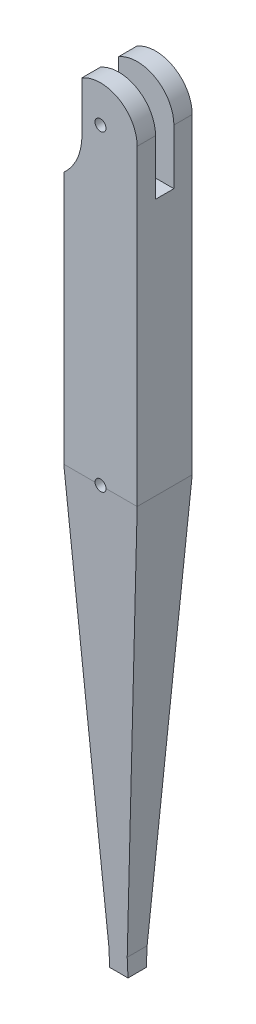
ISO-10303-21;
HEADER;
FILE_DESCRIPTION(('STEP AP214'),'2;1');
FILE_NAME('part.step','',(''),(''),'','','');
FILE_SCHEMA(('AUTOMOTIVE_DESIGN { 1 0 10303 214 1 1 1 1 }'));
ENDSEC;
DATA;
#1=APPLICATION_CONTEXT('core data for automotive mechanical design processes');
#2=APPLICATION_PROTOCOL_DEFINITION('international standard','automotive_design',2000,#1);
#3=PRODUCT_CONTEXT('',#1,'mechanical');
#4=PRODUCT('Part','Part','',(#3));
#5=PRODUCT_RELATED_PRODUCT_CATEGORY('part','',(#4));
#6=PRODUCT_DEFINITION_FORMATION('','',#4);
#7=PRODUCT_DEFINITION_CONTEXT('part definition',#1,'design');
#8=PRODUCT_DEFINITION('design','',#6,#7);
#9=PRODUCT_DEFINITION_SHAPE('','',#8);
#10=(LENGTH_UNIT() NAMED_UNIT(*) SI_UNIT(.MILLI.,.METRE.));
#11=(NAMED_UNIT(*) PLANE_ANGLE_UNIT() SI_UNIT($,.RADIAN.));
#12=(NAMED_UNIT(*) SI_UNIT($,.STERADIAN.) SOLID_ANGLE_UNIT());
#13=UNCERTAINTY_MEASURE_WITH_UNIT(LENGTH_MEASURE(1.E-05),#10,'distance_accuracy_value','');
#14=(GEOMETRIC_REPRESENTATION_CONTEXT(3) GLOBAL_UNCERTAINTY_ASSIGNED_CONTEXT((#13)) GLOBAL_UNIT_ASSIGNED_CONTEXT((#10,
#11,#12)) REPRESENTATION_CONTEXT('',''));
#15=CARTESIAN_POINT('',(0.,0.,0.));
#16=DIRECTION('',(0.,0.,1.));
#17=DIRECTION('',(1.,0.,0.));
#18=AXIS2_PLACEMENT_3D('',#15,#16,#17);
#19=CARTESIAN_POINT('',(0.,-85.,15.));
#20=DIRECTION('',(0.,0.,-1.));
#21=DIRECTION('',(-1.,0.,0.));
#22=AXIS2_PLACEMENT_3D('',#19,#20,#21);
#23=CYLINDRICAL_SURFACE('',#22,1.5);
#24=CARTESIAN_POINT('',(0.,-85.,10.));
#25=DIRECTION('',(0.,0.,1.));
#26=DIRECTION('',(1.,0.,0.));
#27=AXIS2_PLACEMENT_3D('',#24,#25,#26);
#28=CIRCLE('',#27,1.5);
#29=CARTESIAN_POINT('',(1.50000000000001,-85.,10.));
#30=VERTEX_POINT('',#29);
#31=EDGE_CURVE('E252',#30,#30,#28,.T.);
#32=ORIENTED_EDGE('',*,*,#31,.F.);
#33=EDGE_LOOP('',(#32));
#34=FACE_BOUND('',#33,.T.);
#35=CARTESIAN_POINT('',(0.,-85.,15.));
#36=DIRECTION('',(0.,0.,1.));
#37=DIRECTION('',(1.,0.,0.));
#38=AXIS2_PLACEMENT_3D('',#35,#36,#37);
#39=CIRCLE('',#38,1.5);
#40=CARTESIAN_POINT('',(1.50000000000001,-85.,15.));
#41=VERTEX_POINT('',#40);
#42=CARTESIAN_POINT('',(-1.49999999999999,-85.,15.));
#43=VERTEX_POINT('',#42);
#44=EDGE_CURVE('E315',#41,#43,#39,.T.);
#45=ORIENTED_EDGE('',*,*,#44,.T.);
#46=CARTESIAN_POINT('',(0.,-85.,15.));
#47=DIRECTION('',(0.,-0.0425147166248137,0.999095840683121));
#48=DIRECTION('',(0.,-0.999095840683121,-0.0425147166248137));
#49=AXIS2_PLACEMENT_3D('',#46,#47,#48);
#50=ELLIPSE('',#49,1.50135746634116,1.5);
#51=EDGE_CURVE('E356',#43,#41,#50,.T.);
#52=ORIENTED_EDGE('',*,*,#51,.T.);
#53=EDGE_LOOP('',(#45,#52));
#54=FACE_BOUND('',#53,.T.);
#55=ADVANCED_FACE('F33',(#34,#54),#23,.F.);
#56=CARTESIAN_POINT('',(0.,0.,15.));
#57=DIRECTION('',(0.,0.,1.));
#58=DIRECTION('',(1.,0.,0.));
#59=AXIS2_PLACEMENT_3D('',#56,#57,#58);
#60=PLANE('',#59);
#61=CARTESIAN_POINT('',(-20.0470114766486,-5.,15.));
#62=DIRECTION('',(0.,0.,1.));
#63=DIRECTION('',(1.,0.,0.));
#64=AXIS2_PLACEMENT_3D('',#61,#62,#63);
#65=CIRCLE('',#64,15.);
#66=CARTESIAN_POINT('',(-10.,-16.1381129635181,15.));
#67=VERTEX_POINT('',#66);
#68=CARTESIAN_POINT('',(-5.04701147664864,-4.9999999999999,15.));
#69=VERTEX_POINT('',#68);
#70=EDGE_CURVE('E219',#67,#69,#65,.T.);
#71=ORIENTED_EDGE('',*,*,#70,.F.);
#72=DIRECTION('',(0.,-1.,0.));
#73=VECTOR('',#72,1.);
#74=CARTESIAN_POINT('',(-10.,0.,15.));
#75=LINE('',#74,#73);
#76=CARTESIAN_POINT('',(-10.,-85.,15.));
#77=VERTEX_POINT('',#76);
#78=EDGE_CURVE('E324',#67,#77,#75,.T.);
#79=ORIENTED_EDGE('',*,*,#78,.T.);
#80=DIRECTION('',(1.,0.,0.));
#81=VECTOR('',#80,1.);
#82=CARTESIAN_POINT('',(-50.,-85.,15.));
#83=LINE('',#82,#81);
#84=EDGE_CURVE('E279',#77,#43,#83,.T.);
#85=ORIENTED_EDGE('',*,*,#84,.T.);
#86=ORIENTED_EDGE('',*,*,#44,.F.);
#87=CARTESIAN_POINT('',(10.,-85.,15.));
#88=VERTEX_POINT('',#87);
#89=EDGE_CURVE('E275',#41,#88,#83,.T.);
#90=ORIENTED_EDGE('',*,*,#89,.T.);
#91=DIRECTION('',(0.,1.,0.));
#92=VECTOR('',#91,1.);
#93=CARTESIAN_POINT('',(10.,0.,15.));
#94=LINE('',#93,#92);
#95=CARTESIAN_POINT('',(10.,0.,15.));
#96=VERTEX_POINT('',#95);
#97=EDGE_CURVE('E327',#88,#96,#94,.T.);
#98=ORIENTED_EDGE('',*,*,#97,.T.);
#99=CARTESIAN_POINT('',(0.,0.,15.));
#100=DIRECTION('',(0.,0.,1.));
#101=DIRECTION('',(1.,0.,0.));
#102=AXIS2_PLACEMENT_3D('',#99,#100,#101);
#103=CIRCLE('',#102,10.);
#104=CARTESIAN_POINT('',(-5.04701147664864,8.63294128061676,15.));
#105=VERTEX_POINT('',#104);
#106=EDGE_CURVE('E321',#96,#105,#103,.T.);
#107=ORIENTED_EDGE('',*,*,#106,.T.);
#108=DIRECTION('',(0.,1.,0.));
#109=VECTOR('',#108,1.);
#110=CARTESIAN_POINT('',(-5.04701147664864,0.,15.));
#111=LINE('',#110,#109);
#112=EDGE_CURVE('E210',#69,#105,#111,.T.);
#113=ORIENTED_EDGE('',*,*,#112,.F.);
#114=EDGE_LOOP('',(#71,#79,#85,#86,#90,#98,#107,#113));
#115=FACE_BOUND('',#114,.T.);
#116=CARTESIAN_POINT('',(0.,0.,15.));
#117=DIRECTION('',(0.,0.,1.));
#118=DIRECTION('',(1.,0.,0.));
#119=AXIS2_PLACEMENT_3D('',#116,#117,#118);
#120=CIRCLE('',#119,1.5);
#121=CARTESIAN_POINT('',(1.5,0.,15.));
#122=VERTEX_POINT('',#121);
#123=EDGE_CURVE('E309',#122,#122,#120,.T.);
#124=ORIENTED_EDGE('',*,*,#123,.F.);
#125=EDGE_LOOP('',(#124));
#126=FACE_BOUND('',#125,.T.);
#127=ADVANCED_FACE('F430',(#115,#126),#60,.T.);
#128=CARTESIAN_POINT('',(-2.49701529049241,-197.5,15.));
#129=DIRECTION('',(0.997783400521174,0.0665453653112076,0.));
#130=DIRECTION('',(-0.0665453653112076,0.997783400521174,0.));
#131=AXIS2_PLACEMENT_3D('',#128,#129,#130);
#132=PLANE('',#131);
#133=DIRECTION('',(0.,0.,-1.));
#134=VECTOR('',#133,1.);
#135=CARTESIAN_POINT('',(-10.,-85.,15.));
#136=LINE('',#135,#134);
#137=CARTESIAN_POINT('',(-10.,-85.,10.));
#138=VERTEX_POINT('',#137);
#139=EDGE_CURVE('E353',#77,#138,#136,.T.);
#140=ORIENTED_EDGE('',*,*,#139,.T.);
#141=DIRECTION('',(0.0665453653112076,-0.997783400521174,0.));
#142=VECTOR('',#141,1.);
#143=CARTESIAN_POINT('',(-2.49701529049241,-197.5,10.));
#144=LINE('',#143,#142);
#145=CARTESIAN_POINT('',(-8.99960203873232,-100.,10.));
#146=VERTEX_POINT('',#145);
#147=EDGE_CURVE('E255',#138,#146,#144,.T.);
#148=ORIENTED_EDGE('',*,*,#147,.T.);
#149=DIRECTION('',(0.,0.,-1.));
#150=VECTOR('',#149,1.);
#151=CARTESIAN_POINT('',(-8.99960203873232,-100.,15.));
#152=LINE('',#151,#150);
#153=CARTESIAN_POINT('',(-8.99960203873232,-100.,5.));
#154=VERTEX_POINT('',#153);
#155=EDGE_CURVE('E369',#146,#154,#152,.T.);
#156=ORIENTED_EDGE('',*,*,#155,.T.);
#157=DIRECTION('',(-0.0665453653112076,0.997783400521174,0.));
#158=VECTOR('',#157,1.);
#159=CARTESIAN_POINT('',(-2.49701529049241,-197.5,5.));
#160=LINE('',#159,#158);
#161=CARTESIAN_POINT('',(-10.,-85.,5.));
#162=VERTEX_POINT('',#161);
#163=EDGE_CURVE('E249',#154,#162,#160,.T.);
#164=ORIENTED_EDGE('',*,*,#163,.T.);
#165=CARTESIAN_POINT('',(-10.,-85.,0.));
#166=VERTEX_POINT('',#165);
#167=EDGE_CURVE('E352',#162,#166,#136,.T.);
#168=ORIENTED_EDGE('',*,*,#167,.T.);
#169=DIRECTION('',(0.0664854637788897,-0.996885234971507,0.0424206482966599));
#170=VECTOR('',#169,1.);
#171=CARTESIAN_POINT('',(-2.46821164988845,-197.931882736458,4.80561203133864));
#172=LINE('',#171,#170);
#173=CARTESIAN_POINT('',(-2.49701529049241,-197.5,4.78723404255319));
#174=VERTEX_POINT('',#173);
#175=EDGE_CURVE('E272',#166,#174,#172,.T.);
#176=ORIENTED_EDGE('',*,*,#175,.T.);
#177=DIRECTION('',(0.,0.,-1.));
#178=VECTOR('',#177,1.);
#179=CARTESIAN_POINT('',(-2.49701529049241,-197.5,15.));
#180=LINE('',#179,#178);
#181=CARTESIAN_POINT('',(-2.49701529049241,-197.5,10.2127659574468));
#182=VERTEX_POINT('',#181);
#183=EDGE_CURVE('E349',#182,#174,#180,.T.);
#184=ORIENTED_EDGE('',*,*,#183,.F.);
#185=DIRECTION('',(0.0664854637788897,-0.996885234971507,-0.0424206482966599));
#186=VECTOR('',#185,1.);
#187=CARTESIAN_POINT('',(-2.51051699702552,-197.297554967285,10.22138063969));
#188=LINE('',#187,#186);
#189=EDGE_CURVE('E287',#77,#182,#188,.T.);
#190=ORIENTED_EDGE('',*,*,#189,.F.);
#191=EDGE_LOOP('',(#140,#148,#156,#164,#168,#176,#184,#190));
#192=FACE_BOUND('',#191,.T.);
#193=ADVANCED_FACE('F407',(#192),#132,.F.);
#194=CARTESIAN_POINT('',(-2.49701529049241,-202.5,15.));
#195=DIRECTION('',(1.,0.,0.));
#196=DIRECTION('',(0.,0.,-1.));
#197=AXIS2_PLACEMENT_3D('',#194,#195,#196);
#198=PLANE('',#197);
#199=ORIENTED_EDGE('',*,*,#183,.T.);
#200=DIRECTION('',(0.,-0.999095840683121,0.0425147166248137));
#201=VECTOR('',#200,1.);
#202=CARTESIAN_POINT('',(-2.49701529049241,-202.924762765477,5.01807501129688));
#203=LINE('',#202,#201);
#204=CARTESIAN_POINT('',(-2.49701529049241,-202.5,5.));
#205=VERTEX_POINT('',#204);
#206=EDGE_CURVE('E269',#174,#205,#203,.T.);
#207=ORIENTED_EDGE('',*,*,#206,.T.);
#208=DIRECTION('',(0.,0.,-1.));
#209=VECTOR('',#208,1.);
#210=CARTESIAN_POINT('',(-2.49701529049241,-202.5,15.));
#211=LINE('',#210,#209);
#212=CARTESIAN_POINT('',(-2.49701529049241,-202.5,10.));
#213=VERTEX_POINT('',#212);
#214=EDGE_CURVE('E346',#213,#205,#211,.T.);
#215=ORIENTED_EDGE('',*,*,#214,.F.);
#216=DIRECTION('',(0.,-0.999095840683121,-0.0425147166248137));
#217=VECTOR('',#216,1.);
#218=CARTESIAN_POINT('',(-2.49701529049241,-202.287618617262,10.0090375056484));
#219=LINE('',#218,#217);
#220=EDGE_CURVE('E285',#182,#213,#219,.T.);
#221=ORIENTED_EDGE('',*,*,#220,.F.);
#222=EDGE_LOOP('',(#199,#207,#215,#221));
#223=FACE_BOUND('',#222,.T.);
#224=ADVANCED_FACE('F402',(#223),#198,.F.);
#225=CARTESIAN_POINT('',(2.49701529049246,-202.5,15.));
#226=DIRECTION('',(-1.,0.,0.));
#227=DIRECTION('',(0.,0.,1.));
#228=AXIS2_PLACEMENT_3D('',#225,#226,#227);
#229=PLANE('',#228);
#230=DIRECTION('',(0.,0.,-1.));
#231=VECTOR('',#230,1.);
#232=CARTESIAN_POINT('',(2.49701529049246,-202.5,15.));
#233=LINE('',#232,#231);
#234=CARTESIAN_POINT('',(2.49701529049246,-202.5,10.));
#235=VERTEX_POINT('',#234);
#236=CARTESIAN_POINT('',(2.49701529049246,-202.5,5.));
#237=VERTEX_POINT('',#236);
#238=EDGE_CURVE('E343',#235,#237,#233,.T.);
#239=ORIENTED_EDGE('',*,*,#238,.T.);
#240=DIRECTION('',(0.,0.999095840683121,-0.0425147166248137));
#241=VECTOR('',#240,1.);
#242=CARTESIAN_POINT('',(2.49701529049246,-202.924762765477,5.01807501129688));
#243=LINE('',#242,#241);
#244=CARTESIAN_POINT('',(2.49701529049246,-197.5,4.78723404255319));
#245=VERTEX_POINT('',#244);
#246=EDGE_CURVE('E266',#237,#245,#243,.T.);
#247=ORIENTED_EDGE('',*,*,#246,.T.);
#248=DIRECTION('',(0.,0.,-1.));
#249=VECTOR('',#248,1.);
#250=CARTESIAN_POINT('',(2.49701529049246,-197.5,15.));
#251=LINE('',#250,#249);
#252=CARTESIAN_POINT('',(2.49701529049246,-197.5,10.2127659574468));
#253=VERTEX_POINT('',#252);
#254=EDGE_CURVE('E340',#253,#245,#251,.T.);
#255=ORIENTED_EDGE('',*,*,#254,.F.);
#256=DIRECTION('',(0.,0.999095840683121,0.0425147166248137));
#257=VECTOR('',#256,1.);
#258=CARTESIAN_POINT('',(2.49701529049246,-202.287618617262,10.0090375056484));
#259=LINE('',#258,#257);
#260=EDGE_CURVE('E283',#235,#253,#259,.T.);
#261=ORIENTED_EDGE('',*,*,#260,.F.);
#262=EDGE_LOOP('',(#239,#247,#255,#261));
#263=FACE_BOUND('',#262,.T.);
#264=ADVANCED_FACE('F393',(#263),#229,.F.);
#265=CARTESIAN_POINT('',(2.49701529049246,-197.5,15.));
#266=DIRECTION('',(-0.997783400521174,0.0665453653112073,0.));
#267=DIRECTION('',(-0.0665453653112073,-0.997783400521174,0.));
#268=AXIS2_PLACEMENT_3D('',#265,#266,#267);
#269=PLANE('',#268);
#270=ORIENTED_EDGE('',*,*,#254,.T.);
#271=DIRECTION('',(0.0664854637788894,0.996885234971507,-0.0424206482966599));
#272=VECTOR('',#271,1.);
#273=CARTESIAN_POINT('',(2.4682116498885,-197.931882736458,4.80561203133865));
#274=LINE('',#273,#272);
#275=CARTESIAN_POINT('',(10.,-85.,0.));
#276=VERTEX_POINT('',#275);
#277=EDGE_CURVE('E263',#245,#276,#274,.T.);
#278=ORIENTED_EDGE('',*,*,#277,.T.);
#279=DIRECTION('',(0.,0.,-1.));
#280=VECTOR('',#279,1.);
#281=CARTESIAN_POINT('',(10.,-85.,15.));
#282=LINE('',#281,#280);
#283=EDGE_CURVE('E337',#88,#276,#282,.T.);
#284=ORIENTED_EDGE('',*,*,#283,.F.);
#285=DIRECTION('',(0.0664854637788894,0.996885234971507,0.0424206482966599));
#286=VECTOR('',#285,1.);
#287=CARTESIAN_POINT('',(2.51051699702557,-197.297554967285,10.22138063969));
#288=LINE('',#287,#286);
#289=EDGE_CURVE('E278',#253,#88,#288,.T.);
#290=ORIENTED_EDGE('',*,*,#289,.F.);
#291=EDGE_LOOP('',(#270,#278,#284,#290));
#292=FACE_BOUND('',#291,.T.);
#293=ADVANCED_FACE('F388',(#292),#269,.F.);
#294=CARTESIAN_POINT('',(0.,-85.,5.));
#295=DIRECTION('',(0.,0.,-1.));
#296=DIRECTION('',(-1.,0.,0.));
#297=AXIS2_PLACEMENT_3D('',#294,#295,#296);
#298=CIRCLE('',#297,1.5);
#299=CARTESIAN_POINT('',(-1.49999999999999,-85.,5.));
#300=VERTEX_POINT('',#299);
#301=EDGE_CURVE('E240',#300,#300,#298,.T.);
#302=ORIENTED_EDGE('',*,*,#301,.F.);
#303=EDGE_LOOP('',(#302));
#304=FACE_BOUND('',#303,.T.);
#305=CARTESIAN_POINT('',(0.,-85.,0.));
#306=DIRECTION('',(0.,0.0425147166248137,0.999095840683121));
#307=DIRECTION('',(0.,0.999095840683121,-0.0425147166248137));
#308=AXIS2_PLACEMENT_3D('',#305,#306,#307);
#309=ELLIPSE('',#308,1.50135746634116,1.5);
#310=CARTESIAN_POINT('',(-1.49999999999999,-85.,0.));
#311=VERTEX_POINT('',#310);
#312=CARTESIAN_POINT('',(1.50000000000001,-85.,0.));
#313=VERTEX_POINT('',#312);
#314=EDGE_CURVE('E261',#311,#313,#309,.T.);
#315=ORIENTED_EDGE('',*,*,#314,.F.);
#316=CARTESIAN_POINT('',(0.,-85.,0.));
#317=DIRECTION('',(0.,0.,1.));
#318=DIRECTION('',(1.,0.,0.));
#319=AXIS2_PLACEMENT_3D('',#316,#317,#318);
#320=CIRCLE('',#319,1.5);
#321=EDGE_CURVE('E312',#313,#311,#320,.T.);
#322=ORIENTED_EDGE('',*,*,#321,.F.);
#323=EDGE_LOOP('',(#315,#322));
#324=FACE_BOUND('',#323,.T.);
#325=ADVANCED_FACE('F413',(#304,#324),#23,.F.);
#326=CARTESIAN_POINT('',(0.,0.,15.));
#327=DIRECTION('',(0.,0.,-1.));
#328=DIRECTION('',(-1.,0.,0.));
#329=AXIS2_PLACEMENT_3D('',#326,#327,#328);
#330=CYLINDRICAL_SURFACE('',#329,10.);
#331=CARTESIAN_POINT('',(0.,0.,10.));
#332=DIRECTION('',(0.,0.,-1.));
#333=DIRECTION('',(-1.,0.,0.));
#334=AXIS2_PLACEMENT_3D('',#331,#332,#333);
#335=CIRCLE('',#334,10.);
#336=CARTESIAN_POINT('',(-5.04701147664864,8.63294128061676,10.));
#337=VERTEX_POINT('',#336);
#338=CARTESIAN_POINT('',(10.,0.,10.));
#339=VERTEX_POINT('',#338);
#340=EDGE_CURVE('E306',#337,#339,#335,.T.);
#341=ORIENTED_EDGE('',*,*,#340,.F.);
#342=DIRECTION('',(0.,0.,-1.));
#343=VECTOR('',#342,1.);
#344=CARTESIAN_POINT('',(-5.04701147664864,8.63294128061676,15.));
#345=LINE('',#344,#343);
#346=EDGE_CURVE('E207',#337,#105,#345,.F.);
#347=ORIENTED_EDGE('',*,*,#346,.T.);
#348=ORIENTED_EDGE('',*,*,#106,.F.);
#349=DIRECTION('',(0.,0.,-1.));
#350=VECTOR('',#349,1.);
#351=CARTESIAN_POINT('',(10.,0.,15.));
#352=LINE('',#351,#350);
#353=EDGE_CURVE('E334',#96,#339,#352,.T.);
#354=ORIENTED_EDGE('',*,*,#353,.T.);
#355=EDGE_LOOP('',(#341,#347,#348,#354));
#356=FACE_BOUND('',#355,.T.);
#357=ADVANCED_FACE('F415',(#356),#330,.T.);
#358=CARTESIAN_POINT('',(-10.,0.,15.));
#359=DIRECTION('',(1.,0.,0.));
#360=DIRECTION('',(0.,0.,-1.));
#361=AXIS2_PLACEMENT_3D('',#358,#359,#360);
#362=PLANE('',#361);
#363=ORIENTED_EDGE('',*,*,#78,.F.);
#364=DIRECTION('',(0.,0.,-1.));
#365=VECTOR('',#364,1.);
#366=CARTESIAN_POINT('',(-10.,-16.1381129635181,40.));
#367=LINE('',#366,#365);
#368=CARTESIAN_POINT('',(-10.,-16.1381129635181,0.));
#369=VERTEX_POINT('',#368);
#370=EDGE_CURVE('E217',#67,#369,#367,.T.);
#371=ORIENTED_EDGE('',*,*,#370,.T.);
#372=DIRECTION('',(0.,-1.,0.));
#373=VECTOR('',#372,1.);
#374=CARTESIAN_POINT('',(-10.,0.,0.));
#375=LINE('',#374,#373);
#376=EDGE_CURVE('E201',#369,#166,#375,.T.);
#377=ORIENTED_EDGE('',*,*,#376,.T.);
#378=ORIENTED_EDGE('',*,*,#167,.F.);
#379=DIRECTION('',(0.,-1.,0.));
#380=VECTOR('',#379,1.);
#381=CARTESIAN_POINT('',(-10.,-100.,5.));
#382=LINE('',#381,#380);
#383=CARTESIAN_POINT('',(-10.,-70.,5.));
#384=VERTEX_POINT('',#383);
#385=EDGE_CURVE('E226',#384,#162,#382,.T.);
#386=ORIENTED_EDGE('',*,*,#385,.F.);
#387=DIRECTION('',(0.,0.,-1.));
#388=VECTOR('',#387,1.);
#389=CARTESIAN_POINT('',(-10.,-70.,5.));
#390=LINE('',#389,#388);
#391=CARTESIAN_POINT('',(-10.,-70.,10.));
#392=VERTEX_POINT('',#391);
#393=EDGE_CURVE('E221',#392,#384,#390,.T.);
#394=ORIENTED_EDGE('',*,*,#393,.F.);
#395=DIRECTION('',(0.,-1.,0.));
#396=VECTOR('',#395,1.);
#397=CARTESIAN_POINT('',(-10.,0.,10.));
#398=LINE('',#397,#396);
#399=EDGE_CURVE('E366',#392,#138,#398,.T.);
#400=ORIENTED_EDGE('',*,*,#399,.T.);
#401=ORIENTED_EDGE('',*,*,#139,.F.);
#402=EDGE_LOOP('',(#363,#371,#377,#378,#386,#394,#400,#401));
#403=FACE_BOUND('',#402,.T.);
#404=ADVANCED_FACE('F423',(#403),#362,.F.);
#405=CARTESIAN_POINT('',(10.,0.,15.));
#406=DIRECTION('',(-1.,0.,0.));
#407=DIRECTION('',(0.,-1.,0.));
#408=AXIS2_PLACEMENT_3D('',#405,#406,#407);
#409=PLANE('',#408);
#410=DIRECTION('',(0.,1.,0.));
#411=VECTOR('',#410,1.);
#412=CARTESIAN_POINT('',(10.,0.,10.));
#413=LINE('',#412,#411);
#414=CARTESIAN_POINT('',(10.,-15.,10.));
#415=VERTEX_POINT('',#414);
#416=EDGE_CURVE('E295',#415,#339,#413,.T.);
#417=ORIENTED_EDGE('',*,*,#416,.T.);
#418=ORIENTED_EDGE('',*,*,#353,.F.);
#419=ORIENTED_EDGE('',*,*,#97,.F.);
#420=ORIENTED_EDGE('',*,*,#283,.T.);
#421=DIRECTION('',(0.,1.,0.));
#422=VECTOR('',#421,1.);
#423=CARTESIAN_POINT('',(10.,0.,0.));
#424=LINE('',#423,#422);
#425=CARTESIAN_POINT('',(10.,0.,0.));
#426=VERTEX_POINT('',#425);
#427=EDGE_CURVE('E325',#276,#426,#424,.T.);
#428=ORIENTED_EDGE('',*,*,#427,.T.);
#429=CARTESIAN_POINT('',(10.,0.,5.));
#430=VERTEX_POINT('',#429);
#431=EDGE_CURVE('E329',#430,#426,#352,.T.);
#432=ORIENTED_EDGE('',*,*,#431,.F.);
#433=DIRECTION('',(0.,1.,0.));
#434=VECTOR('',#433,1.);
#435=CARTESIAN_POINT('',(10.,0.,5.));
#436=LINE('',#435,#434);
#437=CARTESIAN_POINT('',(10.,-15.,5.));
#438=VERTEX_POINT('',#437);
#439=EDGE_CURVE('E292',#438,#430,#436,.T.);
#440=ORIENTED_EDGE('',*,*,#439,.F.);
#441=DIRECTION('',(0.,0.,-1.));
#442=VECTOR('',#441,1.);
#443=CARTESIAN_POINT('',(10.,-15.,0.));
#444=LINE('',#443,#442);
#445=EDGE_CURVE('E289',#415,#438,#444,.T.);
#446=ORIENTED_EDGE('',*,*,#445,.F.);
#447=EDGE_LOOP('',(#417,#418,#419,#420,#428,#432,#440,#446));
#448=FACE_BOUND('',#447,.T.);
#449=ADVANCED_FACE('F381',(#448),#409,.F.);
#450=CARTESIAN_POINT('',(0.,0.,15.));
#451=DIRECTION('',(0.,0.,-1.));
#452=DIRECTION('',(-1.,0.,0.));
#453=AXIS2_PLACEMENT_3D('',#450,#451,#452);
#454=CYLINDRICAL_SURFACE('',#453,1.5);
#455=ORIENTED_EDGE('',*,*,#123,.T.);
#456=EDGE_LOOP('',(#455));
#457=FACE_BOUND('',#456,.T.);
#458=CARTESIAN_POINT('',(0.,0.,10.));
#459=DIRECTION('',(0.,0.,-1.));
#460=DIRECTION('',(-1.,0.,0.));
#461=AXIS2_PLACEMENT_3D('',#458,#459,#460);
#462=CIRCLE('',#461,1.5);
#463=CARTESIAN_POINT('',(-1.5,0.,10.));
#464=VERTEX_POINT('',#463);
#465=EDGE_CURVE('E305',#464,#464,#462,.T.);
#466=ORIENTED_EDGE('',*,*,#465,.T.);
#467=EDGE_LOOP('',(#466));
#468=FACE_BOUND('',#467,.T.);
#469=ADVANCED_FACE('F470',(#457,#468),#454,.F.);
#470=CARTESIAN_POINT('',(0.,0.,0.));
#471=DIRECTION('',(0.,0.,1.));
#472=DIRECTION('',(1.,0.,0.));
#473=AXIS2_PLACEMENT_3D('',#470,#471,#472);
#474=PLANE('',#473);
#475=ORIENTED_EDGE('',*,*,#376,.F.);
#476=CARTESIAN_POINT('',(-20.0470114766486,-5.,0.));
#477=DIRECTION('',(0.,0.,-1.));
#478=DIRECTION('',(1.,0.,0.));
#479=AXIS2_PLACEMENT_3D('',#476,#477,#478);
#480=CIRCLE('',#479,15.);
#481=CARTESIAN_POINT('',(-5.04701147664864,-4.9999999999999,0.));
#482=VERTEX_POINT('',#481);
#483=EDGE_CURVE('E183',#482,#369,#480,.T.);
#484=ORIENTED_EDGE('',*,*,#483,.F.);
#485=DIRECTION('',(0.,-1.,0.));
#486=VECTOR('',#485,1.);
#487=CARTESIAN_POINT('',(-5.04701147664864,-4.9999999999999,0.));
#488=LINE('',#487,#486);
#489=CARTESIAN_POINT('',(-5.04701147664864,8.63294128061676,0.));
#490=VERTEX_POINT('',#489);
#491=EDGE_CURVE('E187',#490,#482,#488,.T.);
#492=ORIENTED_EDGE('',*,*,#491,.F.);
#493=CARTESIAN_POINT('',(0.,0.,0.));
#494=DIRECTION('',(0.,0.,1.));
#495=DIRECTION('',(1.,0.,0.));
#496=AXIS2_PLACEMENT_3D('',#493,#494,#495);
#497=CIRCLE('',#496,10.);
#498=EDGE_CURVE('E318',#426,#490,#497,.T.);
#499=ORIENTED_EDGE('',*,*,#498,.F.);
#500=ORIENTED_EDGE('',*,*,#427,.F.);
#501=DIRECTION('',(1.,0.,0.));
#502=VECTOR('',#501,1.);
#503=CARTESIAN_POINT('',(-50.,-85.,0.));
#504=LINE('',#503,#502);
#505=EDGE_CURVE('E258',#313,#276,#504,.T.);
#506=ORIENTED_EDGE('',*,*,#505,.F.);
#507=ORIENTED_EDGE('',*,*,#321,.T.);
#508=EDGE_CURVE('E260',#166,#311,#504,.T.);
#509=ORIENTED_EDGE('',*,*,#508,.F.);
#510=EDGE_LOOP('',(#475,#484,#492,#499,#500,#506,#507,#509));
#511=FACE_BOUND('',#510,.T.);
#512=CARTESIAN_POINT('',(0.,0.,0.));
#513=DIRECTION('',(0.,0.,1.));
#514=DIRECTION('',(1.,0.,0.));
#515=AXIS2_PLACEMENT_3D('',#512,#513,#514);
#516=CIRCLE('',#515,1.5);
#517=CARTESIAN_POINT('',(1.5,0.,0.));
#518=VERTEX_POINT('',#517);
#519=EDGE_CURVE('E308',#518,#518,#516,.T.);
#520=ORIENTED_EDGE('',*,*,#519,.T.);
#521=EDGE_LOOP('',(#520));
#522=FACE_BOUND('',#521,.T.);
#523=ADVANCED_FACE('F198',(#511,#522),#474,.F.);
#524=ORIENTED_EDGE('',*,*,#498,.T.);
#525=DIRECTION('',(0.,0.,-1.));
#526=VECTOR('',#525,1.);
#527=CARTESIAN_POINT('',(-5.04701147664864,8.63294128061676,15.));
#528=LINE('',#527,#526);
#529=CARTESIAN_POINT('',(-5.04701147664864,8.63294128061676,5.));
#530=VERTEX_POINT('',#529);
#531=EDGE_CURVE('E192',#490,#530,#528,.F.);
#532=ORIENTED_EDGE('',*,*,#531,.T.);
#533=CARTESIAN_POINT('',(0.,0.,5.));
#534=DIRECTION('',(0.,0.,-1.));
#535=DIRECTION('',(-1.,0.,0.));
#536=AXIS2_PLACEMENT_3D('',#533,#534,#535);
#537=CIRCLE('',#536,10.);
#538=EDGE_CURVE('E303',#530,#430,#537,.T.);
#539=ORIENTED_EDGE('',*,*,#538,.T.);
#540=ORIENTED_EDGE('',*,*,#431,.T.);
#541=EDGE_LOOP('',(#524,#532,#539,#540));
#542=FACE_BOUND('',#541,.T.);
#543=ADVANCED_FACE('F35',(#542),#330,.T.);
#544=CARTESIAN_POINT('',(-2.49701529049241,-202.5,15.));
#545=DIRECTION('',(0.,1.,0.));
#546=DIRECTION('',(0.,0.,1.));
#547=AXIS2_PLACEMENT_3D('',#544,#545,#546);
#548=PLANE('',#547);
#549=ORIENTED_EDGE('',*,*,#214,.T.);
#550=DIRECTION('',(1.,0.,0.));
#551=VECTOR('',#550,1.);
#552=CARTESIAN_POINT('',(-2.49701529049241,-202.5,5.));
#553=LINE('',#552,#551);
#554=EDGE_CURVE('E363',#205,#237,#553,.T.);
#555=ORIENTED_EDGE('',*,*,#554,.T.);
#556=ORIENTED_EDGE('',*,*,#238,.F.);
#557=DIRECTION('',(1.,0.,0.));
#558=VECTOR('',#557,1.);
#559=CARTESIAN_POINT('',(-50.,-202.5,10.));
#560=LINE('',#559,#558);
#561=EDGE_CURVE('E276',#213,#235,#560,.T.);
#562=ORIENTED_EDGE('',*,*,#561,.F.);
#563=EDGE_LOOP('',(#549,#555,#556,#562));
#564=FACE_BOUND('',#563,.T.);
#565=ADVANCED_FACE('F398',(#564),#548,.F.);
#566=CARTESIAN_POINT('',(0.,0.,5.));
#567=DIRECTION('',(0.,0.,-1.));
#568=DIRECTION('',(-1.,0.,0.));
#569=AXIS2_PLACEMENT_3D('',#566,#567,#568);
#570=CIRCLE('',#569,1.5);
#571=CARTESIAN_POINT('',(-1.5,0.,5.));
#572=VERTEX_POINT('',#571);
#573=EDGE_CURVE('E301',#572,#572,#570,.T.);
#574=ORIENTED_EDGE('',*,*,#573,.F.);
#575=EDGE_LOOP('',(#574));
#576=FACE_BOUND('',#575,.T.);
#577=ORIENTED_EDGE('',*,*,#519,.F.);
#578=EDGE_LOOP('',(#577));
#579=FACE_BOUND('',#578,.T.);
#580=ADVANCED_FACE('F466',(#576,#579),#454,.F.);
#581=CARTESIAN_POINT('',(-50.,-15.,0.));
#582=DIRECTION('',(0.,-1.,0.));
#583=DIRECTION('',(1.,0.,0.));
#584=AXIS2_PLACEMENT_3D('',#581,#582,#583);
#585=PLANE('',#584);
#586=DIRECTION('',(1.,0.,0.));
#587=VECTOR('',#586,1.);
#588=CARTESIAN_POINT('',(-50.,-15.,5.));
#589=LINE('',#588,#587);
#590=CARTESIAN_POINT('',(-8.8666715891497,-15.,5.));
#591=VERTEX_POINT('',#590);
#592=EDGE_CURVE('E298',#591,#438,#589,.T.);
#593=ORIENTED_EDGE('',*,*,#592,.F.);
#594=DIRECTION('',(0.,0.,-1.));
#595=VECTOR('',#594,1.);
#596=CARTESIAN_POINT('',(-8.8666715891497,-15.,40.));
#597=LINE('',#596,#595);
#598=CARTESIAN_POINT('',(-8.8666715891497,-15.,10.));
#599=VERTEX_POINT('',#598);
#600=EDGE_CURVE('E212',#591,#599,#597,.F.);
#601=ORIENTED_EDGE('',*,*,#600,.T.);
#602=DIRECTION('',(1.,0.,0.));
#603=VECTOR('',#602,1.);
#604=CARTESIAN_POINT('',(-50.,-15.,10.));
#605=LINE('',#604,#603);
#606=EDGE_CURVE('E299',#599,#415,#605,.T.);
#607=ORIENTED_EDGE('',*,*,#606,.T.);
#608=ORIENTED_EDGE('',*,*,#445,.T.);
#609=EDGE_LOOP('',(#593,#601,#607,#608));
#610=FACE_BOUND('',#609,.T.);
#611=ADVANCED_FACE('F462',(#610),#585,.F.);
#612=CARTESIAN_POINT('',(-50.,0.,10.));
#613=DIRECTION('',(0.,0.,-1.));
#614=DIRECTION('',(-1.,0.,0.));
#615=AXIS2_PLACEMENT_3D('',#612,#613,#614);
#616=PLANE('',#615);
#617=CARTESIAN_POINT('',(-20.0470114766486,-5.,10.));
#618=DIRECTION('',(0.,0.,-1.));
#619=DIRECTION('',(-1.,0.,0.));
#620=AXIS2_PLACEMENT_3D('',#617,#618,#619);
#621=CIRCLE('',#620,15.);
#622=CARTESIAN_POINT('',(-5.04701147664864,-4.9999999999999,10.));
#623=VERTEX_POINT('',#622);
#624=EDGE_CURVE('E215',#623,#599,#621,.T.);
#625=ORIENTED_EDGE('',*,*,#624,.F.);
#626=DIRECTION('',(0.,-1.,0.));
#627=VECTOR('',#626,1.);
#628=CARTESIAN_POINT('',(-5.04701147664864,0.,10.));
#629=LINE('',#628,#627);
#630=EDGE_CURVE('E205',#337,#623,#629,.T.);
#631=ORIENTED_EDGE('',*,*,#630,.F.);
#632=ORIENTED_EDGE('',*,*,#340,.T.);
#633=ORIENTED_EDGE('',*,*,#416,.F.);
#634=ORIENTED_EDGE('',*,*,#606,.F.);
#635=EDGE_LOOP('',(#625,#631,#632,#633,#634));
#636=FACE_BOUND('',#635,.T.);
#637=ORIENTED_EDGE('',*,*,#465,.F.);
#638=EDGE_LOOP('',(#637));
#639=FACE_BOUND('',#638,.T.);
#640=ADVANCED_FACE('F456',(#636,#639),#616,.T.);
#641=CARTESIAN_POINT('',(-50.,0.,5.));
#642=DIRECTION('',(0.,0.,-1.));
#643=DIRECTION('',(-1.,0.,0.));
#644=AXIS2_PLACEMENT_3D('',#641,#642,#643);
#645=PLANE('',#644);
#646=ORIENTED_EDGE('',*,*,#573,.T.);
#647=EDGE_LOOP('',(#646));
#648=FACE_BOUND('',#647,.T.);
#649=DIRECTION('',(0.,-1.,0.));
#650=VECTOR('',#649,1.);
#651=CARTESIAN_POINT('',(-5.04701147664864,0.,5.));
#652=LINE('',#651,#650);
#653=CARTESIAN_POINT('',(-5.04701147664864,-4.9999999999999,5.));
#654=VERTEX_POINT('',#653);
#655=EDGE_CURVE('E41',#530,#654,#652,.T.);
#656=ORIENTED_EDGE('',*,*,#655,.T.);
#657=CARTESIAN_POINT('',(-20.0470114766486,-5.,5.));
#658=DIRECTION('',(0.,0.,-1.));
#659=DIRECTION('',(-1.,0.,0.));
#660=AXIS2_PLACEMENT_3D('',#657,#658,#659);
#661=CIRCLE('',#660,15.);
#662=EDGE_CURVE('E11',#654,#591,#661,.T.);
#663=ORIENTED_EDGE('',*,*,#662,.T.);
#664=ORIENTED_EDGE('',*,*,#592,.T.);
#665=ORIENTED_EDGE('',*,*,#439,.T.);
#666=ORIENTED_EDGE('',*,*,#538,.F.);
#667=EDGE_LOOP('',(#656,#663,#664,#665,#666));
#668=FACE_BOUND('',#667,.T.);
#669=ADVANCED_FACE('F373',(#648,#668),#645,.F.);
#670=CARTESIAN_POINT('',(-50.,-85.,15.));
#671=DIRECTION('',(0.,-0.0425147166248137,0.999095840683121));
#672=DIRECTION('',(0.,-0.999095840683121,-0.0425147166248137));
#673=AXIS2_PLACEMENT_3D('',#670,#671,#672);
#674=PLANE('',#673);
#675=ORIENTED_EDGE('',*,*,#189,.T.);
#676=ORIENTED_EDGE('',*,*,#220,.T.);
#677=ORIENTED_EDGE('',*,*,#561,.T.);
#678=ORIENTED_EDGE('',*,*,#260,.T.);
#679=ORIENTED_EDGE('',*,*,#289,.T.);
#680=ORIENTED_EDGE('',*,*,#89,.F.);
#681=ORIENTED_EDGE('',*,*,#51,.F.);
#682=ORIENTED_EDGE('',*,*,#84,.F.);
#683=EDGE_LOOP('',(#675,#676,#677,#678,#679,#680,#681,#682));
#684=FACE_BOUND('',#683,.T.);
#685=ADVANCED_FACE('F446',(#684),#674,.T.);
#686=CARTESIAN_POINT('',(-50.,-85.,0.));
#687=DIRECTION('',(0.,0.0425147166248137,0.999095840683121));
#688=DIRECTION('',(0.,-0.999095840683121,0.0425147166248137));
#689=AXIS2_PLACEMENT_3D('',#686,#687,#688);
#690=PLANE('',#689);
#691=ORIENTED_EDGE('',*,*,#508,.T.);
#692=ORIENTED_EDGE('',*,*,#314,.T.);
#693=ORIENTED_EDGE('',*,*,#505,.T.);
#694=ORIENTED_EDGE('',*,*,#277,.F.);
#695=ORIENTED_EDGE('',*,*,#246,.F.);
#696=ORIENTED_EDGE('',*,*,#554,.F.);
#697=ORIENTED_EDGE('',*,*,#206,.F.);
#698=ORIENTED_EDGE('',*,*,#175,.F.);
#699=EDGE_LOOP('',(#691,#692,#693,#694,#695,#696,#697,#698));
#700=FACE_BOUND('',#699,.T.);
#701=ADVANCED_FACE('F391',(#700),#690,.F.);
#702=CARTESIAN_POINT('',(5.,-100.,5.));
#703=DIRECTION('',(0.,-1.,0.));
#704=DIRECTION('',(0.,0.,-1.));
#705=AXIS2_PLACEMENT_3D('',#702,#703,#704);
#706=PLANE('',#705);
#707=DIRECTION('',(-1.,0.,0.));
#708=VECTOR('',#707,1.);
#709=CARTESIAN_POINT('',(5.,-100.,10.));
#710=LINE('',#709,#708);
#711=CARTESIAN_POINT('',(5.,-100.,10.));
#712=VERTEX_POINT('',#711);
#713=EDGE_CURVE('E237',#712,#146,#710,.T.);
#714=ORIENTED_EDGE('',*,*,#713,.F.);
#715=DIRECTION('',(0.,0.,1.));
#716=VECTOR('',#715,1.);
#717=CARTESIAN_POINT('',(5.,-100.,5.));
#718=LINE('',#717,#716);
#719=CARTESIAN_POINT('',(5.,-100.,5.));
#720=VERTEX_POINT('',#719);
#721=EDGE_CURVE('E232',#720,#712,#718,.T.);
#722=ORIENTED_EDGE('',*,*,#721,.F.);
#723=DIRECTION('',(-1.,0.,0.));
#724=VECTOR('',#723,1.);
#725=CARTESIAN_POINT('',(5.,-100.,5.));
#726=LINE('',#725,#724);
#727=EDGE_CURVE('E241',#720,#154,#726,.T.);
#728=ORIENTED_EDGE('',*,*,#727,.T.);
#729=ORIENTED_EDGE('',*,*,#155,.F.);
#730=EDGE_LOOP('',(#714,#722,#728,#729));
#731=FACE_BOUND('',#730,.T.);
#732=ADVANCED_FACE('F453',(#731),#706,.F.);
#733=CARTESIAN_POINT('',(5.,-100.,10.));
#734=DIRECTION('',(0.,0.,1.));
#735=DIRECTION('',(1.,0.,0.));
#736=AXIS2_PLACEMENT_3D('',#733,#734,#735);
#737=PLANE('',#736);
#738=ORIENTED_EDGE('',*,*,#31,.T.);
#739=EDGE_LOOP('',(#738));
#740=FACE_BOUND('',#739,.T.);
#741=ORIENTED_EDGE('',*,*,#399,.F.);
#742=DIRECTION('',(-1.,0.,0.));
#743=VECTOR('',#742,1.);
#744=CARTESIAN_POINT('',(5.,-70.,10.));
#745=LINE('',#744,#743);
#746=CARTESIAN_POINT('',(5.,-70.,10.));
#747=VERTEX_POINT('',#746);
#748=EDGE_CURVE('E56',#747,#392,#745,.T.);
#749=ORIENTED_EDGE('',*,*,#748,.F.);
#750=DIRECTION('',(0.,1.,0.));
#751=VECTOR('',#750,1.);
#752=CARTESIAN_POINT('',(5.,-100.,10.));
#753=LINE('',#752,#751);
#754=EDGE_CURVE('E222',#712,#747,#753,.T.);
#755=ORIENTED_EDGE('',*,*,#754,.F.);
#756=ORIENTED_EDGE('',*,*,#713,.T.);
#757=ORIENTED_EDGE('',*,*,#147,.F.);
#758=EDGE_LOOP('',(#741,#749,#755,#756,#757));
#759=FACE_BOUND('',#758,.T.);
#760=ADVANCED_FACE('F565',(#740,#759),#737,.F.);
#761=CARTESIAN_POINT('',(5.,-100.,5.));
#762=DIRECTION('',(0.,0.,-1.));
#763=DIRECTION('',(-1.,0.,0.));
#764=AXIS2_PLACEMENT_3D('',#761,#762,#763);
#765=PLANE('',#764);
#766=ORIENTED_EDGE('',*,*,#301,.T.);
#767=EDGE_LOOP('',(#766));
#768=FACE_BOUND('',#767,.T.);
#769=ORIENTED_EDGE('',*,*,#727,.F.);
#770=DIRECTION('',(0.,-1.,0.));
#771=VECTOR('',#770,1.);
#772=CARTESIAN_POINT('',(5.,-100.,5.));
#773=LINE('',#772,#771);
#774=CARTESIAN_POINT('',(5.,-70.,5.));
#775=VERTEX_POINT('',#774);
#776=EDGE_CURVE('E229',#775,#720,#773,.T.);
#777=ORIENTED_EDGE('',*,*,#776,.F.);
#778=DIRECTION('',(-1.,0.,0.));
#779=VECTOR('',#778,1.);
#780=CARTESIAN_POINT('',(5.,-70.,5.));
#781=LINE('',#780,#779);
#782=EDGE_CURVE('E244',#775,#384,#781,.T.);
#783=ORIENTED_EDGE('',*,*,#782,.T.);
#784=ORIENTED_EDGE('',*,*,#385,.T.);
#785=ORIENTED_EDGE('',*,*,#163,.F.);
#786=EDGE_LOOP('',(#769,#777,#783,#784,#785));
#787=FACE_BOUND('',#786,.T.);
#788=ADVANCED_FACE('F574',(#768,#787),#765,.F.);
#789=CARTESIAN_POINT('',(5.,-70.,5.));
#790=DIRECTION('',(0.,1.,0.));
#791=DIRECTION('',(0.,0.,1.));
#792=AXIS2_PLACEMENT_3D('',#789,#790,#791);
#793=PLANE('',#792);
#794=ORIENTED_EDGE('',*,*,#393,.T.);
#795=ORIENTED_EDGE('',*,*,#782,.F.);
#796=DIRECTION('',(0.,0.,-1.));
#797=VECTOR('',#796,1.);
#798=CARTESIAN_POINT('',(5.,-70.,5.));
#799=LINE('',#798,#797);
#800=EDGE_CURVE('E225',#747,#775,#799,.T.);
#801=ORIENTED_EDGE('',*,*,#800,.F.);
#802=ORIENTED_EDGE('',*,*,#748,.T.);
#803=EDGE_LOOP('',(#794,#795,#801,#802));
#804=FACE_BOUND('',#803,.T.);
#805=ADVANCED_FACE('F582',(#804),#793,.F.);
#806=CARTESIAN_POINT('',(5.,0.,0.));
#807=DIRECTION('',(1.,0.,0.));
#808=DIRECTION('',(0.,0.,-1.));
#809=AXIS2_PLACEMENT_3D('',#806,#807,#808);
#810=PLANE('',#809);
#811=ORIENTED_EDGE('',*,*,#754,.T.);
#812=ORIENTED_EDGE('',*,*,#800,.T.);
#813=ORIENTED_EDGE('',*,*,#776,.T.);
#814=ORIENTED_EDGE('',*,*,#721,.T.);
#815=EDGE_LOOP('',(#811,#812,#813,#814));
#816=FACE_BOUND('',#815,.T.);
#817=ADVANCED_FACE('F591',(#816),#810,.F.);
#818=CARTESIAN_POINT('',(-5.04701147664864,-4.9999999999999,40.));
#819=DIRECTION('',(1.,0.,0.));
#820=DIRECTION('',(0.,0.,-1.));
#821=AXIS2_PLACEMENT_3D('',#818,#819,#820);
#822=PLANE('',#821);
#823=ORIENTED_EDGE('',*,*,#491,.T.);
#824=DIRECTION('',(0.,0.,-1.));
#825=VECTOR('',#824,1.);
#826=CARTESIAN_POINT('',(-5.04701147664864,-4.9999999999999,40.));
#827=LINE('',#826,#825);
#828=EDGE_CURVE('E48',#654,#482,#827,.T.);
#829=ORIENTED_EDGE('',*,*,#828,.F.);
#830=ORIENTED_EDGE('',*,*,#655,.F.);
#831=ORIENTED_EDGE('',*,*,#531,.F.);
#832=EDGE_LOOP('',(#823,#829,#830,#831));
#833=FACE_BOUND('',#832,.T.);
#834=ADVANCED_FACE('F190',(#833),#822,.F.);
#835=CARTESIAN_POINT('',(-20.0470114766486,-5.,40.));
#836=DIRECTION('',(0.,0.,-1.));
#837=DIRECTION('',(-1.,0.,0.));
#838=AXIS2_PLACEMENT_3D('',#835,#836,#837);
#839=CYLINDRICAL_SURFACE('',#838,15.);
#840=ORIENTED_EDGE('',*,*,#70,.T.);
#841=EDGE_CURVE('E186',#69,#623,#827,.T.);
#842=ORIENTED_EDGE('',*,*,#841,.T.);
#843=ORIENTED_EDGE('',*,*,#624,.T.);
#844=ORIENTED_EDGE('',*,*,#600,.F.);
#845=ORIENTED_EDGE('',*,*,#662,.F.);
#846=ORIENTED_EDGE('',*,*,#828,.T.);
#847=ORIENTED_EDGE('',*,*,#483,.T.);
#848=ORIENTED_EDGE('',*,*,#370,.F.);
#849=EDGE_LOOP('',(#840,#842,#843,#844,#845,#846,#847,#848));
#850=FACE_BOUND('',#849,.T.);
#851=ADVANCED_FACE('F181',(#850),#839,.F.);
#852=ORIENTED_EDGE('',*,*,#112,.T.);
#853=ORIENTED_EDGE('',*,*,#346,.F.);
#854=ORIENTED_EDGE('',*,*,#630,.T.);
#855=ORIENTED_EDGE('',*,*,#841,.F.);
#856=EDGE_LOOP('',(#852,#853,#854,#855));
#857=FACE_BOUND('',#856,.T.);
#858=ADVANCED_FACE('F608',(#857),#822,.F.);
#859=CLOSED_SHELL('',(#55,#127,#193,#224,#264,#293,#325,#357,#404,#449,#469,#523,#543,#565,#580,
#611,#640,#669,#685,#701,#732,#760,#788,#805,#817,#834,#851,#858));
#860=MANIFOLD_SOLID_BREP('B2',#859);
#861=ADVANCED_BREP_SHAPE_REPRESENTATION('',(#18,#860),#14);
#862=SHAPE_DEFINITION_REPRESENTATION(#9,#861);
ENDSEC;
END-ISO-10303-21;
